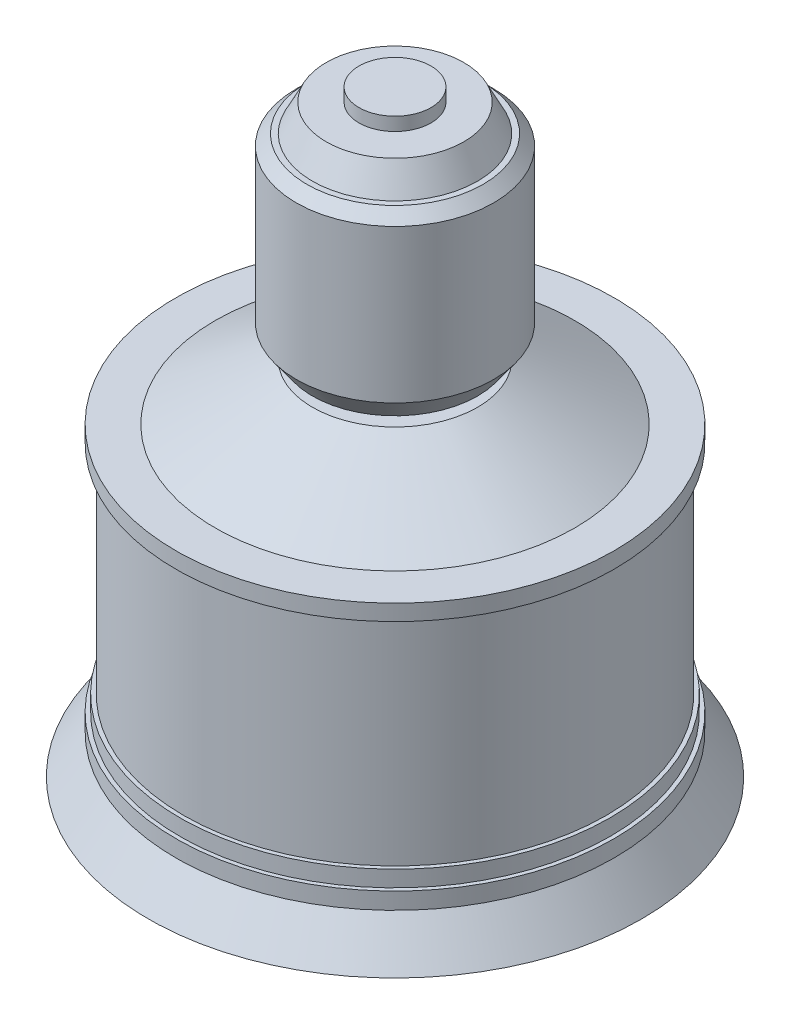
ISO-10303-21;
HEADER;
FILE_DESCRIPTION(('STEP AP214'),'2;1');
FILE_NAME('part.step','',(''),(''),'','','');
FILE_SCHEMA(('AUTOMOTIVE_DESIGN { 1 0 10303 214 1 1 1 1 }'));
ENDSEC;
DATA;
#1=APPLICATION_CONTEXT('core data for automotive mechanical design processes');
#2=APPLICATION_PROTOCOL_DEFINITION('international standard','automotive_design',2000,#1);
#3=PRODUCT_CONTEXT('',#1,'mechanical');
#4=PRODUCT('Part','Part','',(#3));
#5=PRODUCT_RELATED_PRODUCT_CATEGORY('part','',(#4));
#6=PRODUCT_DEFINITION_FORMATION('','',#4);
#7=PRODUCT_DEFINITION_CONTEXT('part definition',#1,'design');
#8=PRODUCT_DEFINITION('design','',#6,#7);
#9=PRODUCT_DEFINITION_SHAPE('','',#8);
#10=(LENGTH_UNIT() NAMED_UNIT(*) SI_UNIT(.MILLI.,.METRE.));
#11=(NAMED_UNIT(*) PLANE_ANGLE_UNIT() SI_UNIT($,.RADIAN.));
#12=(NAMED_UNIT(*) SI_UNIT($,.STERADIAN.) SOLID_ANGLE_UNIT());
#13=UNCERTAINTY_MEASURE_WITH_UNIT(LENGTH_MEASURE(1.E-05),#10,'distance_accuracy_value','');
#14=(GEOMETRIC_REPRESENTATION_CONTEXT(3) GLOBAL_UNCERTAINTY_ASSIGNED_CONTEXT((#13)) GLOBAL_UNIT_ASSIGNED_CONTEXT((#10,
#11,#12)) REPRESENTATION_CONTEXT('',''));
#15=CARTESIAN_POINT('',(0.,0.,0.));
#16=DIRECTION('',(0.,0.,1.));
#17=DIRECTION('',(1.,0.,0.));
#18=AXIS2_PLACEMENT_3D('',#15,#16,#17);
#19=CARTESIAN_POINT('',(126.189433835794,359.251390218109,0.));
#20=DIRECTION('',(0.,-1.,0.));
#21=DIRECTION('',(1.,0.,0.));
#22=AXIS2_PLACEMENT_3D('',#19,#20,#21);
#23=CYLINDRICAL_SURFACE('',#22,27.5);
#24=CARTESIAN_POINT('',(126.189433835794,363.45491433812,0.));
#25=DIRECTION('',(0.,-1.,0.));
#26=DIRECTION('',(1.,0.,0.));
#27=AXIS2_PLACEMENT_3D('',#24,#25,#26);
#28=CIRCLE('',#27,27.5);
#29=CARTESIAN_POINT('',(153.689433835794,363.454914338119,0.));
#30=VERTEX_POINT('',#29);
#31=EDGE_CURVE('E105',#30,#30,#28,.T.);
#32=ORIENTED_EDGE('',*,*,#31,.T.);
#33=EDGE_LOOP('',(#32));
#34=FACE_BOUND('',#33,.T.);
#35=CARTESIAN_POINT('',(126.189433835794,361.388099234127,0.));
#36=DIRECTION('',(0.,-1.,0.));
#37=DIRECTION('',(1.,0.,0.));
#38=AXIS2_PLACEMENT_3D('',#35,#36,#37);
#39=CIRCLE('',#38,27.5);
#40=CARTESIAN_POINT('',(153.689433835794,361.388099234127,0.));
#41=VERTEX_POINT('',#40);
#42=EDGE_CURVE('E10',#41,#41,#39,.T.);
#43=ORIENTED_EDGE('',*,*,#42,.F.);
#44=EDGE_LOOP('',(#43));
#45=FACE_BOUND('',#44,.T.);
#46=ADVANCED_FACE('F38',(#34,#45),#23,.T.);
#47=CARTESIAN_POINT('',(113.570490452215,361.388099234127,0.));
#48=DIRECTION('',(0.,-1.,0.));
#49=DIRECTION('',(1.,0.,0.));
#50=AXIS2_PLACEMENT_3D('',#47,#48,#49);
#51=PLANE('',#50);
#52=CARTESIAN_POINT('',(126.189433835794,361.388099234127,0.));
#53=DIRECTION('',(0.,-1.,0.));
#54=DIRECTION('',(1.,0.,0.));
#55=AXIS2_PLACEMENT_3D('',#52,#53,#54);
#56=CIRCLE('',#55,28.);
#57=CARTESIAN_POINT('',(154.189433835794,361.388099234127,0.));
#58=VERTEX_POINT('',#57);
#59=EDGE_CURVE('E44',#58,#58,#56,.T.);
#60=ORIENTED_EDGE('',*,*,#59,.F.);
#61=EDGE_LOOP('',(#60));
#62=FACE_BOUND('',#61,.T.);
#63=ORIENTED_EDGE('',*,*,#42,.T.);
#64=EDGE_LOOP('',(#63));
#65=FACE_BOUND('',#64,.T.);
#66=ADVANCED_FACE('F142',(#62,#65),#51,.F.);
#67=CARTESIAN_POINT('',(126.189433835794,359.251390218109,0.));
#68=DIRECTION('',(0.,-1.,0.));
#69=DIRECTION('',(1.,0.,0.));
#70=AXIS2_PLACEMENT_3D('',#67,#68,#69);
#71=CYLINDRICAL_SURFACE('',#70,28.);
#72=CARTESIAN_POINT('',(126.189433835794,359.251390218109,0.));
#73=DIRECTION('',(0.,-1.,0.));
#74=DIRECTION('',(1.,0.,0.));
#75=AXIS2_PLACEMENT_3D('',#72,#73,#74);
#76=CIRCLE('',#75,28.);
#77=CARTESIAN_POINT('',(154.189433835794,359.251390218109,0.));
#78=VERTEX_POINT('',#77);
#79=EDGE_CURVE('E48',#78,#78,#76,.T.);
#80=ORIENTED_EDGE('',*,*,#79,.F.);
#81=EDGE_LOOP('',(#80));
#82=FACE_BOUND('',#81,.T.);
#83=ORIENTED_EDGE('',*,*,#59,.T.);
#84=EDGE_LOOP('',(#83));
#85=FACE_BOUND('',#84,.T.);
#86=ADVANCED_FACE('F147',(#82,#85),#71,.T.);
#87=CARTESIAN_POINT('',(126.189433835794,359.251390218109,0.));
#88=DIRECTION('',(0.,-1.,0.));
#89=DIRECTION('',(1.,0.,0.));
#90=AXIS2_PLACEMENT_3D('',#87,#88,#89);
#91=CONICAL_SURFACE('',#90,28.,0.609767625641442);
#92=CARTESIAN_POINT('',(126.189433835794,354.24117676982,0.));
#93=DIRECTION('',(0.,-1.,0.));
#94=DIRECTION('',(1.,0.,0.));
#95=AXIS2_PLACEMENT_3D('',#92,#93,#94);
#96=CIRCLE('',#95,31.5);
#97=CARTESIAN_POINT('',(157.689433835794,354.241176769819,0.));
#98=VERTEX_POINT('',#97);
#99=EDGE_CURVE('E52',#98,#98,#96,.T.);
#100=ORIENTED_EDGE('',*,*,#99,.F.);
#101=EDGE_LOOP('',(#100));
#102=FACE_BOUND('',#101,.T.);
#103=ORIENTED_EDGE('',*,*,#79,.T.);
#104=EDGE_LOOP('',(#103));
#105=FACE_BOUND('',#104,.T.);
#106=ADVANCED_FACE('F232',(#102,#105),#91,.T.);
#107=CARTESIAN_POINT('',(113.570490452215,354.24117676982,0.));
#108=DIRECTION('',(0.,1.,0.));
#109=DIRECTION('',(-1.,0.,0.));
#110=AXIS2_PLACEMENT_3D('',#107,#108,#109);
#111=PLANE('',#110);
#112=CARTESIAN_POINT('',(126.189433835794,354.24117676982,0.));
#113=DIRECTION('',(0.,1.,0.));
#114=DIRECTION('',(-1.,0.,0.));
#115=AXIS2_PLACEMENT_3D('',#112,#113,#114);
#116=CIRCLE('',#115,30.2462904084407);
#117=CARTESIAN_POINT('',(95.9431434273533,354.24117676982,0.));
#118=VERTEX_POINT('',#117);
#119=EDGE_CURVE('E108',#118,#118,#116,.T.);
#120=ORIENTED_EDGE('',*,*,#119,.T.);
#121=EDGE_LOOP('',(#120));
#122=FACE_BOUND('',#121,.T.);
#123=ORIENTED_EDGE('',*,*,#99,.T.);
#124=EDGE_LOOP('',(#123));
#125=FACE_BOUND('',#124,.T.);
#126=ADVANCED_FACE('F228',(#122,#125),#111,.F.);
#127=CARTESIAN_POINT('',(113.57049045221,430.577167211913,0.));
#128=DIRECTION('',(0.,1.,0.));
#129=DIRECTION('',(-1.,0.,0.));
#130=AXIS2_PLACEMENT_3D('',#127,#128,#129);
#131=PLANE('',#130);
#132=CARTESIAN_POINT('',(126.189433835794,430.577167211912,0.));
#133=DIRECTION('',(0.,-1.,0.));
#134=DIRECTION('',(1.,0.,0.));
#135=AXIS2_PLACEMENT_3D('',#132,#133,#134);
#136=CIRCLE('',#135,4.60425848620695);
#137=CARTESIAN_POINT('',(130.793692322001,430.577167211912,0.));
#138=VERTEX_POINT('',#137);
#139=EDGE_CURVE('E57',#138,#138,#136,.T.);
#140=ORIENTED_EDGE('',*,*,#139,.F.);
#141=EDGE_LOOP('',(#140));
#142=FACE_BOUND('',#141,.T.);
#143=ADVANCED_FACE('F224',(#142),#131,.T.);
#144=CARTESIAN_POINT('',(126.189433835794,359.251390218109,0.));
#145=DIRECTION('',(0.,-1.,0.));
#146=DIRECTION('',(1.,0.,0.));
#147=AXIS2_PLACEMENT_3D('',#144,#145,#146);
#148=CYLINDRICAL_SURFACE('',#147,4.60425848620727);
#149=ORIENTED_EDGE('',*,*,#139,.T.);
#150=EDGE_LOOP('',(#149));
#151=FACE_BOUND('',#150,.T.);
#152=CARTESIAN_POINT('',(126.189433835794,428.878205134878,0.));
#153=DIRECTION('',(0.,-1.,0.));
#154=DIRECTION('',(1.,0.,0.));
#155=AXIS2_PLACEMENT_3D('',#152,#153,#154);
#156=CIRCLE('',#155,4.60425848620759);
#157=CARTESIAN_POINT('',(130.793692322002,428.878205134878,0.));
#158=VERTEX_POINT('',#157);
#159=EDGE_CURVE('E60',#158,#158,#156,.T.);
#160=ORIENTED_EDGE('',*,*,#159,.F.);
#161=EDGE_LOOP('',(#160));
#162=FACE_BOUND('',#161,.T.);
#163=ADVANCED_FACE('F220',(#151,#162),#148,.T.);
#164=CARTESIAN_POINT('',(113.570490452215,428.878205134878,0.));
#165=DIRECTION('',(0.,1.,0.));
#166=DIRECTION('',(-1.,0.,0.));
#167=AXIS2_PLACEMENT_3D('',#164,#165,#166);
#168=PLANE('',#167);
#169=ORIENTED_EDGE('',*,*,#159,.T.);
#170=EDGE_LOOP('',(#169));
#171=FACE_BOUND('',#170,.T.);
#172=CARTESIAN_POINT('',(126.189433835794,428.878205134878,0.));
#173=DIRECTION('',(0.,-1.,0.));
#174=DIRECTION('',(1.,0.,0.));
#175=AXIS2_PLACEMENT_3D('',#172,#173,#174);
#176=CIRCLE('',#175,8.78631898352495);
#177=CARTESIAN_POINT('',(134.975752819319,428.878205134878,0.));
#178=VERTEX_POINT('',#177);
#179=EDGE_CURVE('E63',#178,#178,#176,.T.);
#180=ORIENTED_EDGE('',*,*,#179,.F.);
#181=EDGE_LOOP('',(#180));
#182=FACE_BOUND('',#181,.T.);
#183=ADVANCED_FACE('F216',(#171,#182),#168,.T.);
#184=CARTESIAN_POINT('',(126.189433835794,425.403579975082,0.));
#185=DIRECTION('',(0.,-1.,0.));
#186=DIRECTION('',(1.,0.,0.));
#187=AXIS2_PLACEMENT_3D('',#184,#185,#186);
#188=CONICAL_SURFACE('',#187,10.5506257558307,0.469843436193326);
#189=ORIENTED_EDGE('',*,*,#179,.T.);
#190=EDGE_LOOP('',(#189));
#191=FACE_BOUND('',#190,.T.);
#192=CARTESIAN_POINT('',(126.189433835794,425.403579975082,0.));
#193=DIRECTION('',(0.,-1.,0.));
#194=DIRECTION('',(1.,0.,0.));
#195=AXIS2_PLACEMENT_3D('',#192,#193,#194);
#196=CIRCLE('',#195,10.5506257558307);
#197=CARTESIAN_POINT('',(136.740059591625,425.403579975082,0.));
#198=VERTEX_POINT('',#197);
#199=EDGE_CURVE('E66',#198,#198,#196,.T.);
#200=ORIENTED_EDGE('',*,*,#199,.F.);
#201=EDGE_LOOP('',(#200));
#202=FACE_BOUND('',#201,.T.);
#203=ADVANCED_FACE('F212',(#191,#202),#188,.T.);
#204=CARTESIAN_POINT('',(113.570490452215,425.403579975082,0.));
#205=DIRECTION('',(0.,1.,0.));
#206=DIRECTION('',(-1.,0.,0.));
#207=AXIS2_PLACEMENT_3D('',#204,#205,#206);
#208=PLANE('',#207);
#209=ORIENTED_EDGE('',*,*,#199,.T.);
#210=EDGE_LOOP('',(#209));
#211=FACE_BOUND('',#210,.T.);
#212=CARTESIAN_POINT('',(126.189433835794,425.403579975082,0.));
#213=DIRECTION('',(0.,-1.,0.));
#214=DIRECTION('',(1.,0.,0.));
#215=AXIS2_PLACEMENT_3D('',#212,#213,#214);
#216=CIRCLE('',#215,11.2580610933522);
#217=CARTESIAN_POINT('',(137.447494929146,425.403579975082,0.));
#218=VERTEX_POINT('',#217);
#219=EDGE_CURVE('E69',#218,#218,#216,.T.);
#220=ORIENTED_EDGE('',*,*,#219,.F.);
#221=EDGE_LOOP('',(#220));
#222=FACE_BOUND('',#221,.T.);
#223=ADVANCED_FACE('F208',(#211,#222),#208,.T.);
#224=CARTESIAN_POINT('',(126.189433835794,424.042697684854,0.));
#225=DIRECTION('',(0.,-1.,0.));
#226=DIRECTION('',(1.,0.,0.));
#227=AXIS2_PLACEMENT_3D('',#224,#225,#226);
#228=CONICAL_SURFACE('',#227,12.6189433835795,0.785398163397432);
#229=ORIENTED_EDGE('',*,*,#219,.T.);
#230=EDGE_LOOP('',(#229));
#231=FACE_BOUND('',#230,.T.);
#232=CARTESIAN_POINT('',(126.189433835794,424.042697684854,0.));
#233=DIRECTION('',(0.,-1.,0.));
#234=DIRECTION('',(1.,0.,0.));
#235=AXIS2_PLACEMENT_3D('',#232,#233,#234);
#236=CIRCLE('',#235,12.6189433835795);
#237=CARTESIAN_POINT('',(138.808377219374,424.042697684854,0.));
#238=VERTEX_POINT('',#237);
#239=EDGE_CURVE('E72',#238,#238,#236,.T.);
#240=ORIENTED_EDGE('',*,*,#239,.F.);
#241=EDGE_LOOP('',(#240));
#242=FACE_BOUND('',#241,.T.);
#243=ADVANCED_FACE('F204',(#231,#242),#228,.T.);
#244=CARTESIAN_POINT('',(126.189433835794,359.251390218109,0.));
#245=DIRECTION('',(0.,-1.,0.));
#246=DIRECTION('',(1.,0.,0.));
#247=AXIS2_PLACEMENT_3D('',#244,#245,#246);
#248=CYLINDRICAL_SURFACE('',#247,12.6189433835795);
#249=ORIENTED_EDGE('',*,*,#239,.T.);
#250=EDGE_LOOP('',(#249));
#251=FACE_BOUND('',#250,.T.);
#252=CARTESIAN_POINT('',(126.189433835794,404.50463379895,0.));
#253=DIRECTION('',(0.,-1.,0.));
#254=DIRECTION('',(1.,0.,0.));
#255=AXIS2_PLACEMENT_3D('',#252,#253,#254);
#256=CIRCLE('',#255,12.6189433835794);
#257=CARTESIAN_POINT('',(138.808377219374,404.50463379895,0.));
#258=VERTEX_POINT('',#257);
#259=EDGE_CURVE('E75',#258,#258,#256,.T.);
#260=ORIENTED_EDGE('',*,*,#259,.F.);
#261=EDGE_LOOP('',(#260));
#262=FACE_BOUND('',#261,.T.);
#263=ADVANCED_FACE('F200',(#251,#262),#248,.T.);
#264=CARTESIAN_POINT('',(126.189433835794,401.629467207044,0.));
#265=DIRECTION('',(0.,1.,0.));
#266=DIRECTION('',(-1.,0.,0.));
#267=AXIS2_PLACEMENT_3D('',#264,#265,#266);
#268=CONICAL_SURFACE('',#267,10.5506257558306,0.623610089731662);
#269=ORIENTED_EDGE('',*,*,#259,.T.);
#270=EDGE_LOOP('',(#269));
#271=FACE_BOUND('',#270,.T.);
#272=CARTESIAN_POINT('',(126.189433835794,401.629467207044,0.));
#273=DIRECTION('',(0.,-1.,0.));
#274=DIRECTION('',(1.,0.,0.));
#275=AXIS2_PLACEMENT_3D('',#272,#273,#274);
#276=CIRCLE('',#275,10.5506257558306);
#277=CARTESIAN_POINT('',(136.740059591625,401.629467207044,0.));
#278=VERTEX_POINT('',#277);
#279=EDGE_CURVE('E78',#278,#278,#276,.T.);
#280=ORIENTED_EDGE('',*,*,#279,.F.);
#281=EDGE_LOOP('',(#280));
#282=FACE_BOUND('',#281,.T.);
#283=ADVANCED_FACE('F196',(#271,#282),#268,.T.);
#284=CARTESIAN_POINT('',(113.570490452215,401.629467207044,0.));
#285=DIRECTION('',(0.,-1.,0.));
#286=DIRECTION('',(1.,0.,0.));
#287=AXIS2_PLACEMENT_3D('',#284,#285,#286);
#288=PLANE('',#287);
#289=ORIENTED_EDGE('',*,*,#279,.T.);
#290=EDGE_LOOP('',(#289));
#291=FACE_BOUND('',#290,.T.);
#292=CARTESIAN_POINT('',(126.189433835794,401.629467207044,0.));
#293=DIRECTION('',(0.,-1.,0.));
#294=DIRECTION('',(1.,0.,0.));
#295=AXIS2_PLACEMENT_3D('',#292,#293,#294);
#296=CIRCLE('',#295,5.45373952472507);
#297=CARTESIAN_POINT('',(131.643173360519,401.629467207044,0.));
#298=VERTEX_POINT('',#297);
#299=EDGE_CURVE('E81',#298,#298,#296,.T.);
#300=ORIENTED_EDGE('',*,*,#299,.F.);
#301=EDGE_LOOP('',(#300));
#302=FACE_BOUND('',#301,.T.);
#303=ADVANCED_FACE('F192',(#291,#302),#288,.T.);
#304=CARTESIAN_POINT('',(126.189433835794,359.251390218109,0.));
#305=DIRECTION('',(0.,-1.,0.));
#306=DIRECTION('',(1.,0.,0.));
#307=AXIS2_PLACEMENT_3D('',#304,#305,#306);
#308=CYLINDRICAL_SURFACE('',#307,5.45373952472506);
#309=ORIENTED_EDGE('',*,*,#299,.T.);
#310=EDGE_LOOP('',(#309));
#311=FACE_BOUND('',#310,.T.);
#312=CARTESIAN_POINT('',(126.189433835794,400.387917996903,0.));
#313=DIRECTION('',(0.,-1.,0.));
#314=DIRECTION('',(1.,0.,0.));
#315=AXIS2_PLACEMENT_3D('',#312,#313,#314);
#316=CIRCLE('',#315,5.45373952472506);
#317=CARTESIAN_POINT('',(131.643173360519,400.387917996903,0.));
#318=VERTEX_POINT('',#317);
#319=EDGE_CURVE('E84',#318,#318,#316,.T.);
#320=ORIENTED_EDGE('',*,*,#319,.F.);
#321=EDGE_LOOP('',(#320));
#322=FACE_BOUND('',#321,.T.);
#323=ADVANCED_FACE('F188',(#311,#322),#308,.T.);
#324=CARTESIAN_POINT('',(113.570490452215,400.387917996903,0.));
#325=DIRECTION('',(0.,1.,0.));
#326=DIRECTION('',(-1.,0.,0.));
#327=AXIS2_PLACEMENT_3D('',#324,#325,#326);
#328=PLANE('',#327);
#329=ORIENTED_EDGE('',*,*,#319,.T.);
#330=EDGE_LOOP('',(#329));
#331=FACE_BOUND('',#330,.T.);
#332=CARTESIAN_POINT('',(126.189433835794,400.387917996903,0.));
#333=DIRECTION('',(0.,-1.,0.));
#334=DIRECTION('',(1.,0.,0.));
#335=AXIS2_PLACEMENT_3D('',#332,#333,#334);
#336=CIRCLE('',#335,10.5506257558306);
#337=CARTESIAN_POINT('',(136.740059591625,400.387917996903,0.));
#338=VERTEX_POINT('',#337);
#339=EDGE_CURVE('E87',#338,#338,#336,.T.);
#340=ORIENTED_EDGE('',*,*,#339,.F.);
#341=EDGE_LOOP('',(#340));
#342=FACE_BOUND('',#341,.T.);
#343=ADVANCED_FACE('F184',(#331,#342),#328,.T.);
#344=CARTESIAN_POINT('',(126.189433835794,393.24117676982,0.));
#345=DIRECTION('',(0.,-1.,0.));
#346=DIRECTION('',(1.,0.,0.));
#347=AXIS2_PLACEMENT_3D('',#344,#345,#346);
#348=CONICAL_SURFACE('',#347,22.9661178572415,1.04848801789655);
#349=ORIENTED_EDGE('',*,*,#339,.T.);
#350=EDGE_LOOP('',(#349));
#351=FACE_BOUND('',#350,.T.);
#352=CARTESIAN_POINT('',(126.189433835794,393.24117676982,0.));
#353=DIRECTION('',(0.,-1.,0.));
#354=DIRECTION('',(1.,0.,0.));
#355=AXIS2_PLACEMENT_3D('',#352,#353,#354);
#356=CIRCLE('',#355,22.9661178572415);
#357=CARTESIAN_POINT('',(149.155551693036,393.241176769819,0.));
#358=VERTEX_POINT('',#357);
#359=EDGE_CURVE('E90',#358,#358,#356,.T.);
#360=ORIENTED_EDGE('',*,*,#359,.F.);
#361=EDGE_LOOP('',(#360));
#362=FACE_BOUND('',#361,.T.);
#363=ADVANCED_FACE('F180',(#351,#362),#348,.T.);
#364=CARTESIAN_POINT('',(113.570490452215,393.24117676982,0.));
#365=DIRECTION('',(0.,1.,0.));
#366=DIRECTION('',(-1.,0.,0.));
#367=AXIS2_PLACEMENT_3D('',#364,#365,#366);
#368=PLANE('',#367);
#369=ORIENTED_EDGE('',*,*,#359,.T.);
#370=EDGE_LOOP('',(#369));
#371=FACE_BOUND('',#370,.T.);
#372=CARTESIAN_POINT('',(126.189433835794,393.241176769819,0.));
#373=DIRECTION('',(0.,-1.,0.));
#374=DIRECTION('',(1.,0.,0.));
#375=AXIS2_PLACEMENT_3D('',#372,#373,#374);
#376=CIRCLE('',#375,28.0000000000001);
#377=CARTESIAN_POINT('',(154.189433835794,393.241176769819,0.));
#378=VERTEX_POINT('',#377);
#379=EDGE_CURVE('E93',#378,#378,#376,.T.);
#380=ORIENTED_EDGE('',*,*,#379,.F.);
#381=EDGE_LOOP('',(#380));
#382=FACE_BOUND('',#381,.T.);
#383=ADVANCED_FACE('F176',(#371,#382),#368,.T.);
#384=CARTESIAN_POINT('',(126.189433835794,359.251390218109,0.));
#385=DIRECTION('',(0.,-1.,0.));
#386=DIRECTION('',(1.,0.,0.));
#387=AXIS2_PLACEMENT_3D('',#384,#385,#386);
#388=CYLINDRICAL_SURFACE('',#387,28.0000000000001);
#389=CARTESIAN_POINT('',(126.189433835794,391.198123687584,0.));
#390=DIRECTION('',(0.,-1.,0.));
#391=DIRECTION('',(1.,0.,0.));
#392=AXIS2_PLACEMENT_3D('',#389,#390,#391);
#393=CIRCLE('',#392,28.0000000000001);
#394=CARTESIAN_POINT('',(154.189433835794,391.198123687584,0.));
#395=VERTEX_POINT('',#394);
#396=EDGE_CURVE('E96',#395,#395,#393,.T.);
#397=ORIENTED_EDGE('',*,*,#396,.F.);
#398=EDGE_LOOP('',(#397));
#399=FACE_BOUND('',#398,.T.);
#400=ORIENTED_EDGE('',*,*,#379,.T.);
#401=EDGE_LOOP('',(#400));
#402=FACE_BOUND('',#401,.T.);
#403=ADVANCED_FACE('F172',(#399,#402),#388,.T.);
#404=CARTESIAN_POINT('',(113.570490452215,391.198123687584,0.));
#405=DIRECTION('',(0.,1.,0.));
#406=DIRECTION('',(-1.,0.,0.));
#407=AXIS2_PLACEMENT_3D('',#404,#405,#406);
#408=PLANE('',#407);
#409=CARTESIAN_POINT('',(126.189433835794,391.198123687584,0.));
#410=DIRECTION('',(0.,-1.,0.));
#411=DIRECTION('',(1.,0.,0.));
#412=AXIS2_PLACEMENT_3D('',#409,#410,#411);
#413=CIRCLE('',#412,27.0000000000001);
#414=CARTESIAN_POINT('',(153.189433835794,391.198123687584,0.));
#415=VERTEX_POINT('',#414);
#416=EDGE_CURVE('E99',#415,#415,#413,.T.);
#417=ORIENTED_EDGE('',*,*,#416,.F.);
#418=EDGE_LOOP('',(#417));
#419=FACE_BOUND('',#418,.T.);
#420=ORIENTED_EDGE('',*,*,#396,.T.);
#421=EDGE_LOOP('',(#420));
#422=FACE_BOUND('',#421,.T.);
#423=ADVANCED_FACE('F165',(#419,#422),#408,.F.);
#424=CARTESIAN_POINT('',(126.189433835794,359.251390218109,0.));
#425=DIRECTION('',(0.,-1.,0.));
#426=DIRECTION('',(1.,0.,0.));
#427=AXIS2_PLACEMENT_3D('',#424,#425,#426);
#428=CYLINDRICAL_SURFACE('',#427,27.0000000000001);
#429=CARTESIAN_POINT('',(126.189433835794,363.45491433812,0.));
#430=DIRECTION('',(0.,-1.,0.));
#431=DIRECTION('',(1.,0.,0.));
#432=AXIS2_PLACEMENT_3D('',#429,#430,#431);
#433=CIRCLE('',#432,27.);
#434=CARTESIAN_POINT('',(153.189433835794,363.454914338119,0.));
#435=VERTEX_POINT('',#434);
#436=EDGE_CURVE('E102',#435,#435,#433,.T.);
#437=ORIENTED_EDGE('',*,*,#436,.F.);
#438=EDGE_LOOP('',(#437));
#439=FACE_BOUND('',#438,.T.);
#440=ORIENTED_EDGE('',*,*,#416,.T.);
#441=EDGE_LOOP('',(#440));
#442=FACE_BOUND('',#441,.T.);
#443=ADVANCED_FACE('F155',(#439,#442),#428,.T.);
#444=CARTESIAN_POINT('',(113.570490452215,363.45491433812,0.));
#445=DIRECTION('',(0.,1.,0.));
#446=DIRECTION('',(-1.,0.,0.));
#447=AXIS2_PLACEMENT_3D('',#444,#445,#446);
#448=PLANE('',#447);
#449=ORIENTED_EDGE('',*,*,#436,.T.);
#450=EDGE_LOOP('',(#449));
#451=FACE_BOUND('',#450,.T.);
#452=ORIENTED_EDGE('',*,*,#31,.F.);
#453=EDGE_LOOP('',(#452));
#454=FACE_BOUND('',#453,.T.);
#455=ADVANCED_FACE('F152',(#451,#454),#448,.T.);
#456=CARTESIAN_POINT('',(126.189433835794,359.251390218109,0.));
#457=DIRECTION('',(0.,-1.,0.));
#458=DIRECTION('',(1.,0.,0.));
#459=AXIS2_PLACEMENT_3D('',#456,#457,#458);
#460=CONICAL_SURFACE('',#459,26.6337905651215,0.624699181675244);
#461=ORIENTED_EDGE('',*,*,#119,.F.);
#462=EDGE_LOOP('',(#461));
#463=FACE_BOUND('',#462,.T.);
#464=CARTESIAN_POINT('',(126.189433835794,359.251390218109,0.));
#465=DIRECTION('',(0.,1.,0.));
#466=DIRECTION('',(-1.,0.,0.));
#467=AXIS2_PLACEMENT_3D('',#464,#465,#466);
#468=CIRCLE('',#467,26.6337905651215);
#469=CARTESIAN_POINT('',(99.5556432706725,359.251390218109,0.));
#470=VERTEX_POINT('',#469);
#471=EDGE_CURVE('E111',#470,#470,#468,.T.);
#472=ORIENTED_EDGE('',*,*,#471,.T.);
#473=EDGE_LOOP('',(#472));
#474=FACE_BOUND('',#473,.T.);
#475=ADVANCED_FACE('F154',(#463,#474),#460,.F.);
#476=CARTESIAN_POINT('',(126.189433835794,391.527548179016,0.));
#477=DIRECTION('',(0.,1.,0.));
#478=DIRECTION('',(-1.,0.,0.));
#479=AXIS2_PLACEMENT_3D('',#476,#477,#478);
#480=CYLINDRICAL_SURFACE('',#479,26.6337905651215);
#481=ORIENTED_EDGE('',*,*,#471,.F.);
#482=EDGE_LOOP('',(#481));
#483=FACE_BOUND('',#482,.T.);
#484=CARTESIAN_POINT('',(126.189433835794,360.710919564981,0.));
#485=DIRECTION('',(0.,1.,0.));
#486=DIRECTION('',(-1.,0.,0.));
#487=AXIS2_PLACEMENT_3D('',#484,#485,#486);
#488=CIRCLE('',#487,26.6337905651215);
#489=CARTESIAN_POINT('',(99.5556432706725,360.710919564981,0.));
#490=VERTEX_POINT('',#489);
#491=EDGE_CURVE('E114',#490,#490,#488,.T.);
#492=ORIENTED_EDGE('',*,*,#491,.T.);
#493=EDGE_LOOP('',(#492));
#494=FACE_BOUND('',#493,.T.);
#495=ADVANCED_FACE('F162',(#483,#494),#480,.F.);
#496=CARTESIAN_POINT('',(99.5556432706725,360.710919564981,0.));
#497=DIRECTION('',(0.,1.,0.));
#498=DIRECTION('',(-1.,0.,0.));
#499=AXIS2_PLACEMENT_3D('',#496,#497,#498);
#500=PLANE('',#499);
#501=ORIENTED_EDGE('',*,*,#491,.F.);
#502=EDGE_LOOP('',(#501));
#503=FACE_BOUND('',#502,.T.);
#504=CARTESIAN_POINT('',(126.189433835794,360.710919564981,0.));
#505=DIRECTION('',(0.,1.,0.));
#506=DIRECTION('',(-1.,0.,0.));
#507=AXIS2_PLACEMENT_3D('',#504,#505,#506);
#508=CIRCLE('',#507,25.7871109143435);
#509=CARTESIAN_POINT('',(100.40232292145,360.710919564981,0.));
#510=VERTEX_POINT('',#509);
#511=EDGE_CURVE('E117',#510,#510,#508,.T.);
#512=ORIENTED_EDGE('',*,*,#511,.T.);
#513=EDGE_LOOP('',(#512));
#514=FACE_BOUND('',#513,.T.);
#515=ADVANCED_FACE('F338',(#503,#514),#500,.F.);
#516=CARTESIAN_POINT('',(126.189433835794,391.527548179016,0.));
#517=DIRECTION('',(0.,1.,0.));
#518=DIRECTION('',(-1.,0.,0.));
#519=AXIS2_PLACEMENT_3D('',#516,#517,#518);
#520=CYLINDRICAL_SURFACE('',#519,25.7871109143435);
#521=ORIENTED_EDGE('',*,*,#511,.F.);
#522=EDGE_LOOP('',(#521));
#523=FACE_BOUND('',#522,.T.);
#524=CARTESIAN_POINT('',(126.189433835794,362.771173381874,0.));
#525=DIRECTION('',(0.,1.,0.));
#526=DIRECTION('',(-1.,0.,0.));
#527=AXIS2_PLACEMENT_3D('',#524,#525,#526);
#528=CIRCLE('',#527,25.7871109143436);
#529=CARTESIAN_POINT('',(100.40232292145,362.771173381874,0.));
#530=VERTEX_POINT('',#529);
#531=EDGE_CURVE('E120',#530,#530,#528,.T.);
#532=ORIENTED_EDGE('',*,*,#531,.T.);
#533=EDGE_LOOP('',(#532));
#534=FACE_BOUND('',#533,.T.);
#535=ADVANCED_FACE('F345',(#523,#534),#520,.F.);
#536=CARTESIAN_POINT('',(100.40232292145,362.771173381874,0.));
#537=DIRECTION('',(0.,1.,0.));
#538=DIRECTION('',(-1.,0.,0.));
#539=AXIS2_PLACEMENT_3D('',#536,#537,#538);
#540=PLANE('',#539);
#541=ORIENTED_EDGE('',*,*,#531,.F.);
#542=EDGE_LOOP('',(#541));
#543=FACE_BOUND('',#542,.T.);
#544=CARTESIAN_POINT('',(126.189433835794,362.771173381874,0.));
#545=DIRECTION('',(0.,1.,0.));
#546=DIRECTION('',(-1.,0.,0.));
#547=AXIS2_PLACEMENT_3D('',#544,#545,#546);
#548=CIRCLE('',#547,24.799317988436);
#549=CARTESIAN_POINT('',(101.390115847358,362.771173381874,0.));
#550=VERTEX_POINT('',#549);
#551=EDGE_CURVE('E123',#550,#550,#548,.T.);
#552=ORIENTED_EDGE('',*,*,#551,.T.);
#553=EDGE_LOOP('',(#552));
#554=FACE_BOUND('',#553,.T.);
#555=ADVANCED_FACE('F138',(#543,#554),#540,.F.);
#556=CARTESIAN_POINT('',(126.189433835794,391.527548179016,0.));
#557=DIRECTION('',(0.,1.,0.));
#558=DIRECTION('',(-1.,0.,0.));
#559=AXIS2_PLACEMENT_3D('',#556,#557,#558);
#560=CYLINDRICAL_SURFACE('',#559,24.799317988436);
#561=ORIENTED_EDGE('',*,*,#551,.F.);
#562=EDGE_LOOP('',(#561));
#563=FACE_BOUND('',#562,.T.);
#564=CARTESIAN_POINT('',(126.189433835794,391.527548179016,0.));
#565=DIRECTION('',(0.,1.,0.));
#566=DIRECTION('',(-1.,0.,0.));
#567=AXIS2_PLACEMENT_3D('',#564,#565,#566);
#568=CIRCLE('',#567,24.7993179884361);
#569=CARTESIAN_POINT('',(101.390115847358,391.527548179016,0.));
#570=VERTEX_POINT('',#569);
#571=EDGE_CURVE('E126',#570,#570,#568,.T.);
#572=ORIENTED_EDGE('',*,*,#571,.T.);
#573=EDGE_LOOP('',(#572));
#574=FACE_BOUND('',#573,.T.);
#575=ADVANCED_FACE('F130',(#563,#574),#560,.F.);
#576=CARTESIAN_POINT('',(101.390115847358,391.527548179016,0.));
#577=DIRECTION('',(0.,1.,0.));
#578=DIRECTION('',(-1.,0.,0.));
#579=AXIS2_PLACEMENT_3D('',#576,#577,#578);
#580=PLANE('',#579);
#581=ORIENTED_EDGE('',*,*,#571,.F.);
#582=EDGE_LOOP('',(#581));
#583=FACE_BOUND('',#582,.T.);
#584=ADVANCED_FACE('F132',(#583),#580,.F.);
#585=CLOSED_SHELL('',(#46,#66,#86,#106,#126,#143,#163,#183,#203,#223,#243,#263,#283,#303,#323,
#343,#363,#383,#403,#423,#443,#455,#475,#495,#515,#535,#555,#575,#584));
#586=MANIFOLD_SOLID_BREP('B2',#585);
#587=ADVANCED_BREP_SHAPE_REPRESENTATION('',(#18,#586),#14);
#588=SHAPE_DEFINITION_REPRESENTATION(#9,#587);
ENDSEC;
END-ISO-10303-21;
